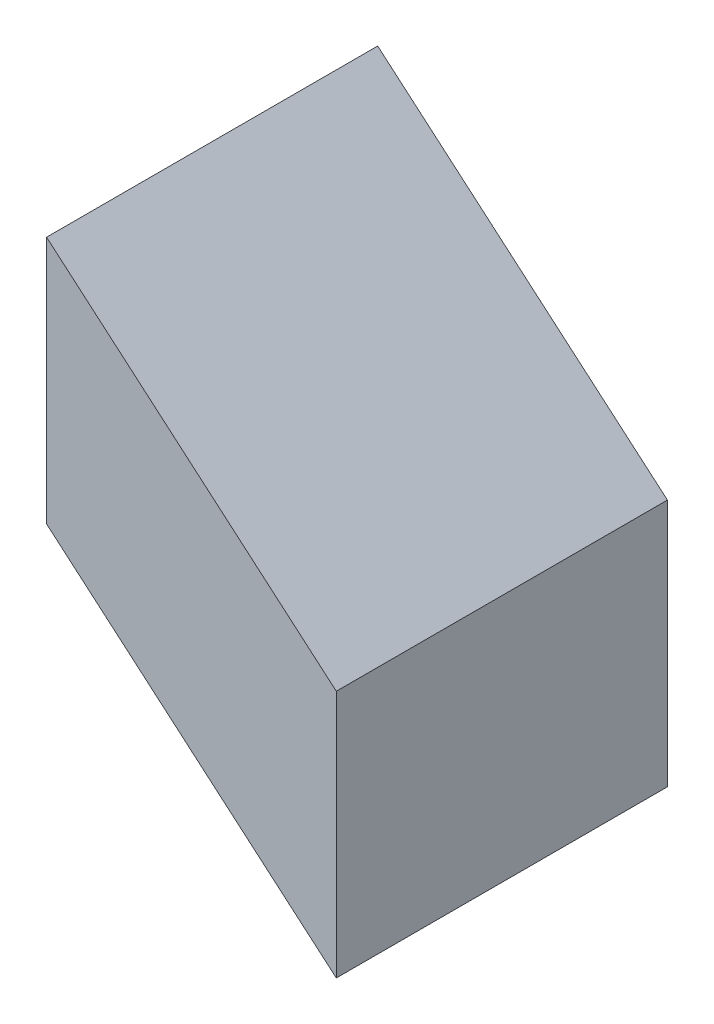
ISO-10303-21;
HEADER;
FILE_DESCRIPTION(('STEP AP214'),'2;1');
FILE_NAME('part.step','',(''),(''),'','','');
FILE_SCHEMA(('AUTOMOTIVE_DESIGN { 1 0 10303 214 1 1 1 1 }'));
ENDSEC;
DATA;
#1=APPLICATION_CONTEXT('core data for automotive mechanical design processes');
#2=APPLICATION_PROTOCOL_DEFINITION('international standard','automotive_design',2000,#1);
#3=PRODUCT_CONTEXT('',#1,'mechanical');
#4=PRODUCT('Part','Part','',(#3));
#5=PRODUCT_RELATED_PRODUCT_CATEGORY('part','',(#4));
#6=PRODUCT_DEFINITION_FORMATION('','',#4);
#7=PRODUCT_DEFINITION_CONTEXT('part definition',#1,'design');
#8=PRODUCT_DEFINITION('design','',#6,#7);
#9=PRODUCT_DEFINITION_SHAPE('','',#8);
#10=(LENGTH_UNIT() NAMED_UNIT(*) SI_UNIT(.MILLI.,.METRE.));
#11=(NAMED_UNIT(*) PLANE_ANGLE_UNIT() SI_UNIT($,.RADIAN.));
#12=(NAMED_UNIT(*) SI_UNIT($,.STERADIAN.) SOLID_ANGLE_UNIT());
#13=UNCERTAINTY_MEASURE_WITH_UNIT(LENGTH_MEASURE(1.E-05),#10,'distance_accuracy_value','');
#14=(GEOMETRIC_REPRESENTATION_CONTEXT(3) GLOBAL_UNCERTAINTY_ASSIGNED_CONTEXT((#13)) GLOBAL_UNIT_ASSIGNED_CONTEXT((#10,
#11,#12)) REPRESENTATION_CONTEXT('',''));
#15=CARTESIAN_POINT('',(0.,0.,0.));
#16=DIRECTION('',(0.,0.,1.));
#17=DIRECTION('',(1.,0.,0.));
#18=AXIS2_PLACEMENT_3D('',#15,#16,#17);
#19=CARTESIAN_POINT('',(-44.45,38.1,50.8));
#20=DIRECTION('',(-0.650791373455968,-0.759256602365297,0.));
#21=DIRECTION('',(0.759256602365297,-0.650791373455968,0.));
#22=AXIS2_PLACEMENT_3D('',#19,#20,#21);
#23=PLANE('',#22);
#24=DIRECTION('',(-0.759256602365297,0.650791373455968,0.));
#25=VECTOR('',#24,1.);
#26=CARTESIAN_POINT('',(-44.45,38.1,0.));
#27=LINE('',#26,#25);
#28=CARTESIAN_POINT('',(0.,0.,0.));
#29=VERTEX_POINT('',#28);
#30=CARTESIAN_POINT('',(-44.45,38.1,0.));
#31=VERTEX_POINT('',#30);
#32=EDGE_CURVE('E104',#29,#31,#27,.T.);
#33=ORIENTED_EDGE('',*,*,#32,.T.);
#34=DIRECTION('',(0.,0.,-1.));
#35=VECTOR('',#34,1.);
#36=CARTESIAN_POINT('',(-44.45,38.1,50.8));
#37=LINE('',#36,#35);
#38=CARTESIAN_POINT('',(-44.45,38.1,50.8));
#39=VERTEX_POINT('',#38);
#40=EDGE_CURVE('E11',#39,#31,#37,.T.);
#41=ORIENTED_EDGE('',*,*,#40,.F.);
#42=DIRECTION('',(-0.759256602365297,0.650791373455968,0.));
#43=VECTOR('',#42,1.);
#44=CARTESIAN_POINT('',(-44.45,38.1,50.8));
#45=LINE('',#44,#43);
#46=CARTESIAN_POINT('',(0.,0.,50.8));
#47=VERTEX_POINT('',#46);
#48=EDGE_CURVE('E92',#47,#39,#45,.T.);
#49=ORIENTED_EDGE('',*,*,#48,.F.);
#50=DIRECTION('',(0.,0.,-1.));
#51=VECTOR('',#50,1.);
#52=CARTESIAN_POINT('',(0.,0.,50.8));
#53=LINE('',#52,#51);
#54=EDGE_CURVE('E100',#47,#29,#53,.T.);
#55=ORIENTED_EDGE('',*,*,#54,.T.);
#56=EDGE_LOOP('',(#33,#41,#49,#55));
#57=FACE_BOUND('',#56,.T.);
#58=ADVANCED_FACE('F41',(#57),#23,.F.);
#59=CARTESIAN_POINT('',(-44.45,0.,50.8));
#60=DIRECTION('',(1.,0.,0.));
#61=DIRECTION('',(0.,0.,-1.));
#62=AXIS2_PLACEMENT_3D('',#59,#60,#61);
#63=PLANE('',#62);
#64=DIRECTION('',(0.,-1.,0.));
#65=VECTOR('',#64,1.);
#66=CARTESIAN_POINT('',(-44.45,0.,0.));
#67=LINE('',#66,#65);
#68=CARTESIAN_POINT('',(-44.45,0.,0.));
#69=VERTEX_POINT('',#68);
#70=EDGE_CURVE('E96',#31,#69,#67,.T.);
#71=ORIENTED_EDGE('',*,*,#70,.T.);
#72=DIRECTION('',(0.,0.,-1.));
#73=VECTOR('',#72,1.);
#74=CARTESIAN_POINT('',(-44.45,0.,50.8));
#75=LINE('',#74,#73);
#76=CARTESIAN_POINT('',(-44.45,0.,50.8));
#77=VERTEX_POINT('',#76);
#78=EDGE_CURVE('E49',#77,#69,#75,.T.);
#79=ORIENTED_EDGE('',*,*,#78,.F.);
#80=DIRECTION('',(0.,-1.,0.));
#81=VECTOR('',#80,1.);
#82=CARTESIAN_POINT('',(-44.45,0.,50.8));
#83=LINE('',#82,#81);
#84=EDGE_CURVE('E87',#39,#77,#83,.T.);
#85=ORIENTED_EDGE('',*,*,#84,.F.);
#86=ORIENTED_EDGE('',*,*,#40,.T.);
#87=EDGE_LOOP('',(#71,#79,#85,#86));
#88=FACE_BOUND('',#87,.T.);
#89=ADVANCED_FACE('F95',(#88),#63,.F.);
#90=CARTESIAN_POINT('',(0.,-38.1,50.8));
#91=DIRECTION('',(0.650791373455968,0.759256602365296,0.));
#92=DIRECTION('',(-0.759256602365297,0.650791373455969,0.));
#93=AXIS2_PLACEMENT_3D('',#90,#91,#92);
#94=PLANE('',#93);
#95=DIRECTION('',(0.759256602365297,-0.650791373455969,0.));
#96=VECTOR('',#95,1.);
#97=CARTESIAN_POINT('',(0.,-38.1,0.));
#98=LINE('',#97,#96);
#99=CARTESIAN_POINT('',(0.,-38.1,0.));
#100=VERTEX_POINT('',#99);
#101=EDGE_CURVE('E74',#69,#100,#98,.T.);
#102=ORIENTED_EDGE('',*,*,#101,.T.);
#103=DIRECTION('',(0.,0.,-1.));
#104=VECTOR('',#103,1.);
#105=CARTESIAN_POINT('',(0.,-38.1,50.8));
#106=LINE('',#105,#104);
#107=CARTESIAN_POINT('',(0.,-38.1,50.8));
#108=VERTEX_POINT('',#107);
#109=EDGE_CURVE('E97',#108,#100,#106,.T.);
#110=ORIENTED_EDGE('',*,*,#109,.F.);
#111=DIRECTION('',(0.759256602365297,-0.650791373455969,0.));
#112=VECTOR('',#111,1.);
#113=CARTESIAN_POINT('',(0.,-38.1,50.8));
#114=LINE('',#113,#112);
#115=EDGE_CURVE('E90',#77,#108,#114,.T.);
#116=ORIENTED_EDGE('',*,*,#115,.F.);
#117=ORIENTED_EDGE('',*,*,#78,.T.);
#118=EDGE_LOOP('',(#102,#110,#116,#117));
#119=FACE_BOUND('',#118,.T.);
#120=ADVANCED_FACE('F98',(#119),#94,.F.);
#121=CARTESIAN_POINT('',(0.,0.,50.8));
#122=DIRECTION('',(-1.,0.,0.));
#123=DIRECTION('',(0.,-1.,0.));
#124=AXIS2_PLACEMENT_3D('',#121,#122,#123);
#125=PLANE('',#124);
#126=DIRECTION('',(0.,1.,0.));
#127=VECTOR('',#126,1.);
#128=CARTESIAN_POINT('',(0.,0.,0.));
#129=LINE('',#128,#127);
#130=EDGE_CURVE('E80',#100,#29,#129,.T.);
#131=ORIENTED_EDGE('',*,*,#130,.T.);
#132=ORIENTED_EDGE('',*,*,#54,.F.);
#133=DIRECTION('',(0.,1.,0.));
#134=VECTOR('',#133,1.);
#135=CARTESIAN_POINT('',(0.,0.,50.8));
#136=LINE('',#135,#134);
#137=EDGE_CURVE('E57',#108,#47,#136,.T.);
#138=ORIENTED_EDGE('',*,*,#137,.F.);
#139=ORIENTED_EDGE('',*,*,#109,.T.);
#140=EDGE_LOOP('',(#131,#132,#138,#139));
#141=FACE_BOUND('',#140,.T.);
#142=ADVANCED_FACE('F111',(#141),#125,.F.);
#143=CARTESIAN_POINT('',(0.,0.,50.8));
#144=DIRECTION('',(0.,0.,-1.));
#145=DIRECTION('',(-1.,0.,0.));
#146=AXIS2_PLACEMENT_3D('',#143,#144,#145);
#147=PLANE('',#146);
#148=ORIENTED_EDGE('',*,*,#48,.T.);
#149=ORIENTED_EDGE('',*,*,#84,.T.);
#150=ORIENTED_EDGE('',*,*,#115,.T.);
#151=ORIENTED_EDGE('',*,*,#137,.T.);
#152=EDGE_LOOP('',(#148,#149,#150,#151));
#153=FACE_BOUND('',#152,.T.);
#154=ADVANCED_FACE('F88',(#153),#147,.F.);
#155=CARTESIAN_POINT('',(0.,0.,0.));
#156=DIRECTION('',(0.,0.,-1.));
#157=DIRECTION('',(-1.,0.,0.));
#158=AXIS2_PLACEMENT_3D('',#155,#156,#157);
#159=PLANE('',#158);
#160=ORIENTED_EDGE('',*,*,#32,.F.);
#161=ORIENTED_EDGE('',*,*,#130,.F.);
#162=ORIENTED_EDGE('',*,*,#101,.F.);
#163=ORIENTED_EDGE('',*,*,#70,.F.);
#164=EDGE_LOOP('',(#160,#161,#162,#163));
#165=FACE_BOUND('',#164,.T.);
#166=ADVANCED_FACE('F114',(#165),#159,.T.);
#167=CLOSED_SHELL('',(#58,#89,#120,#142,#154,#166));
#168=MANIFOLD_SOLID_BREP('B2',#167);
#169=ADVANCED_BREP_SHAPE_REPRESENTATION('',(#18,#168),#14);
#170=SHAPE_DEFINITION_REPRESENTATION(#9,#169);
ENDSEC;
END-ISO-10303-21;
